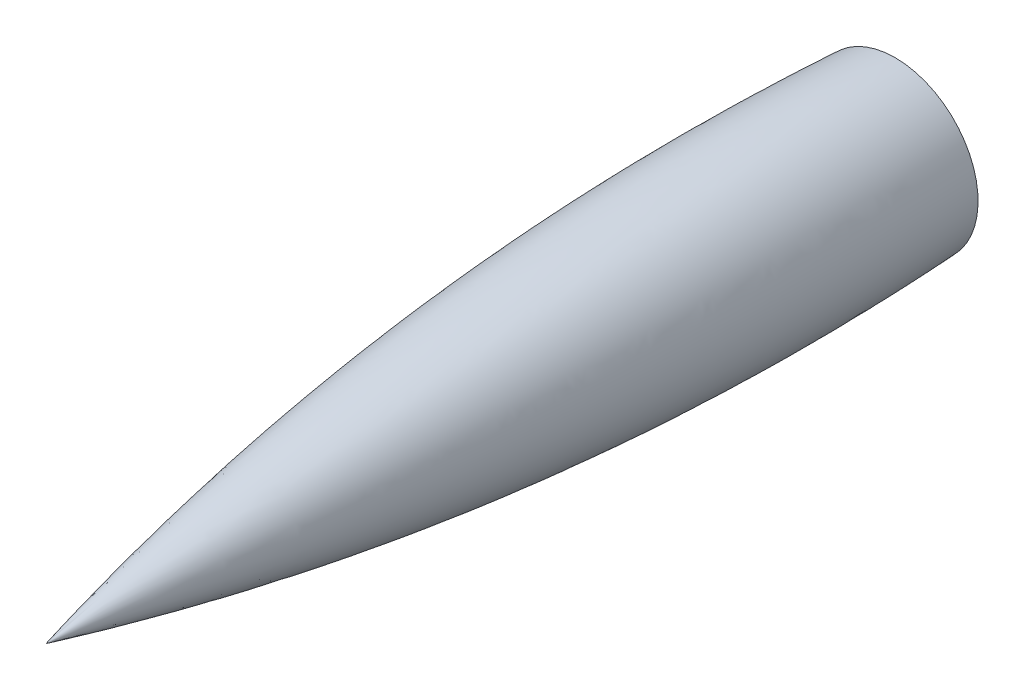
ISO-10303-21;
HEADER;
FILE_DESCRIPTION(('STEP AP214'),'2;1');
FILE_NAME('part.step','',(''),(''),'','','');
FILE_SCHEMA(('AUTOMOTIVE_DESIGN { 1 0 10303 214 1 1 1 1 }'));
ENDSEC;
DATA;
#1=APPLICATION_CONTEXT('core data for automotive mechanical design processes');
#2=APPLICATION_PROTOCOL_DEFINITION('international standard','automotive_design',2000,#1);
#3=PRODUCT_CONTEXT('',#1,'mechanical');
#4=PRODUCT('Part','Part','',(#3));
#5=PRODUCT_RELATED_PRODUCT_CATEGORY('part','',(#4));
#6=PRODUCT_DEFINITION_FORMATION('','',#4);
#7=PRODUCT_DEFINITION_CONTEXT('part definition',#1,'design');
#8=PRODUCT_DEFINITION('design','',#6,#7);
#9=PRODUCT_DEFINITION_SHAPE('','',#8);
#10=(LENGTH_UNIT() NAMED_UNIT(*) SI_UNIT(.MILLI.,.METRE.));
#11=(NAMED_UNIT(*) PLANE_ANGLE_UNIT() SI_UNIT($,.RADIAN.));
#12=(NAMED_UNIT(*) SI_UNIT($,.STERADIAN.) SOLID_ANGLE_UNIT());
#13=UNCERTAINTY_MEASURE_WITH_UNIT(LENGTH_MEASURE(1.E-05),#10,'distance_accuracy_value','');
#14=(GEOMETRIC_REPRESENTATION_CONTEXT(3) GLOBAL_UNCERTAINTY_ASSIGNED_CONTEXT((#13)) GLOBAL_UNIT_ASSIGNED_CONTEXT((#10,
#11,#12)) REPRESENTATION_CONTEXT('',''));
#15=CARTESIAN_POINT('',(0.,0.,0.));
#16=DIRECTION('',(0.,0.,1.));
#17=DIRECTION('',(1.,0.,0.));
#18=AXIS2_PLACEMENT_3D('',#15,#16,#17);
#19=CARTESIAN_POINT('',(0.,50.8,0.));
#20=DIRECTION('',(0.,0.,-1.));
#21=DIRECTION('',(-1.,0.,0.));
#22=AXIS2_PLACEMENT_3D('',#19,#20,#21);
#23=PLANE('',#22);
#24=CARTESIAN_POINT('',(0.,0.,0.));
#25=DIRECTION('',(0.,0.,-1.));
#26=DIRECTION('',(-1.,0.,0.));
#27=AXIS2_PLACEMENT_3D('',#24,#25,#26);
#28=CIRCLE('',#27,50.8);
#29=CARTESIAN_POINT('',(-50.8,0.,0.));
#30=VERTEX_POINT('',#29);
#31=EDGE_CURVE('E11',#30,#30,#28,.T.);
#32=ORIENTED_EDGE('',*,*,#31,.T.);
#33=EDGE_LOOP('',(#32));
#34=FACE_BOUND('',#33,.T.);
#35=ADVANCED_FACE('F43',(#34),#23,.T.);
#36=CARTESIAN_POINT('',(0.,50.7999999998733,-2.41468736994463E-09));
#37=CARTESIAN_POINT('',(0.,50.8344496583285,0.656325330514135));
#38=CARTESIAN_POINT('',(0.,50.9015860372794,1.95310116485376));
#39=CARTESIAN_POINT('',(0.,51.0971294079764,5.7848122386559));
#40=CARTESIAN_POINT('',(0.,51.2956188358835,9.93833270022586));
#41=CARTESIAN_POINT('',(0.,51.5619017563783,15.755387557603));
#42=CARTESIAN_POINT('',(0.,51.7786475100311,21.0006155793538));
#43=CARTESIAN_POINT('',(0.,51.9662861229136,25.7975580308033));
#44=CARTESIAN_POINT('',(0.,52.1340960676188,30.429252212788));
#45=CARTESIAN_POINT('',(0.,52.2953022473931,35.1476493262037));
#46=CARTESIAN_POINT('',(0.,52.4640763328492,40.594655893124));
#47=CARTESIAN_POINT('',(0.,52.6365743999901,46.8563854198712));
#48=CARTESIAN_POINT('',(0.,52.7858228438298,53.1001108175265));
#49=CARTESIAN_POINT('',(0.,52.9451565363754,60.9171714804088));
#50=CARTESIAN_POINT('',(0.,53.0670247835638,68.7285333546036));
#51=CARTESIAN_POINT('',(0.,53.1519841681486,76.5446653968054));
#52=CARTESIAN_POINT('',(0.,53.1996749854819,84.3585527011658));
#53=CARTESIAN_POINT('',(0.,53.215606741412,90.6109174906038));
#54=CARTESIAN_POINT('',(0.,53.2076269691938,98.4255921138609));
#55=CARTESIAN_POINT('',(0.,53.1535111369304,107.803524448155));
#56=CARTESIAN_POINT('',(0.,53.0253744196485,118.743639035915));
#57=CARTESIAN_POINT('',(0.,52.7898237507742,131.245436000156));
#58=CARTESIAN_POINT('',(0.,52.4651625475604,143.745144795457));
#59=CARTESIAN_POINT('',(0.,52.0514149540583,156.242276319098));
#60=CARTESIAN_POINT('',(0.,51.5485975052339,168.736108779601));
#61=CARTESIAN_POINT('',(0.,50.9567384597539,181.226058865898));
#62=CARTESIAN_POINT('',(0.,50.1056481866805,196.832812473818));
#63=CARTESIAN_POINT('',(0.,48.5066299801333,221.789843552109));
#64=CARTESIAN_POINT('',(0.,45.2339196161076,262.298591105179));
#65=CARTESIAN_POINT('',(0.,40.1260961301056,308.919110012708));
#66=CARTESIAN_POINT('',(0.,34.0173878601227,352.262040317426));
#67=CARTESIAN_POINT('',(0.,28.4108054227198,386.188736482174));
#68=CARTESIAN_POINT('',(0.,25.1331348662426,404.656073835249));
#69=CARTESIAN_POINT('',(0.,22.8603267449889,416.951719189199));
#70=CARTESIAN_POINT('',(0.,20.499923970076,429.230890156466));
#71=CARTESIAN_POINT('',(0.,18.3580547716022,439.960110351439));
#72=CARTESIAN_POINT('',(0.,16.4675537273828,449.14558532436));
#73=CARTESIAN_POINT('',(0.,14.8558230959575,456.792400492443));
#74=CARTESIAN_POINT('',(0.,13.5445763678177,462.905486595897));
#75=CARTESIAN_POINT('',(0.,11.8784485478793,470.540346311792));
#76=CARTESIAN_POINT('',(0.,10.1757818093779,478.168296197522));
#77=CARTESIAN_POINT('',(0.,8.4373634399768,485.78619006458));
#78=CARTESIAN_POINT('',(0.,6.83953136772947,492.637509349606));
#79=CARTESIAN_POINT('',(0.,5.76174961808524,497.197916541881));
#80=CARTESIAN_POINT('',(0.,4.85259612971877,501.003922124367));
#81=CARTESIAN_POINT('',(0.,4.12416304655946,504.030343387405));
#82=CARTESIAN_POINT('',(0.,3.37960373274348,507.097949038796));
#83=CARTESIAN_POINT('',(0.,2.65400660063649,510.067543281247));
#84=CARTESIAN_POINT('',(0.,1.86773418835682,513.255046963903));
#85=CARTESIAN_POINT('',(0.,1.20384216788744,515.934279565072));
#86=CARTESIAN_POINT('',(0.,0.482005609219628,518.814891084789));
#87=CARTESIAN_POINT('',(0.,0.160648957528935,520.093508427382));
#88=CARTESIAN_POINT('',(0.,5.12783935113806E-10,520.730801482956));
#89=B_SPLINE_CURVE_WITH_KNOTS('',4,(#36,#37,#38,#39,#40,#41,#42,#43,#44,#45,#46,#47,#48,#49,#50,
#51,#52,#53,#54,#55,#56,#57,#58,#59,#60,#61,#62,#63,#64,#65,#66,#67,#68,#69,#70,#71,#72,#73,#74,
#75,#76,#77,#78,#79,#80,#81,#82,#83,#84,#85,#86,#87,#88),.UNSPECIFIED.,.F.,.F.,(5,1,1,1,1,1,1,1,
1,1,1,1,1,1,1,1,1,1,1,1,1,1,1,1,1,1,1,1,1,1,1,1,1,1,1,1,1,1,1,1,1,1,1,1,1,1,1,1,1,5),
(0.083392030305151,0.0883979450668735,0.093403859828596,0.103415689352041,0.113427518875486,
0.12343934839893,0.128445264942202,0.133451181485473,0.143463014572017,0.15347484765856,
0.163486680745103,0.173498513479235,0.183510346213367,0.203534011681632,0.213545844953633,
0.223557678225634,0.233569511497635,0.243581344769636,0.263605006438705,0.283628668107773,
0.30365233359727,0.323675999086768,0.343699664896976,0.363723330707185,0.383746994608227,
0.40377065850927,0.443817991784031,0.52391265193305,0.644054637964714,0.704125650277602,
0.724149311425776,0.744172970769913,0.76419663011405,0.784220293910096,0.804243957706142,
0.814255798012992,0.824267638319842,0.834279478626692,0.844291318933542,0.864314973341373,
0.874326800545288,0.884338627749204,0.889344547189883,0.894350466630562,0.899356386071241,
0.90436230551192,0.909368224952599,0.914374144393277,0.919380063833956,0.924385983274635),.UNSPECIFIED.);
#90=CARTESIAN_POINT('',(0.,0.,0.));
#91=DIRECTION('',(0.,0.,-1.));
#92=AXIS1_PLACEMENT('',#90,#91);
#93=SURFACE_OF_REVOLUTION('',#89,#92);
#94=CARTESIAN_POINT('',(0.,5.12783935113806E-10,520.730801482956));
#95=VERTEX_POINT('',#94);
#96=VERTEX_LOOP('',#95);
#97=FACE_BOUND('',#96,.T.);
#98=ORIENTED_EDGE('',*,*,#31,.F.);
#99=EDGE_LOOP('',(#98));
#100=FACE_BOUND('',#99,.T.);
#101=ADVANCED_FACE('F51',(#97,#100),#93,.F.);
#102=CLOSED_SHELL('',(#35,#101));
#103=MANIFOLD_SOLID_BREP('B2',#102);
#104=ADVANCED_BREP_SHAPE_REPRESENTATION('',(#18,#103),#14);
#105=SHAPE_DEFINITION_REPRESENTATION(#9,#104);
ENDSEC;
END-ISO-10303-21;
